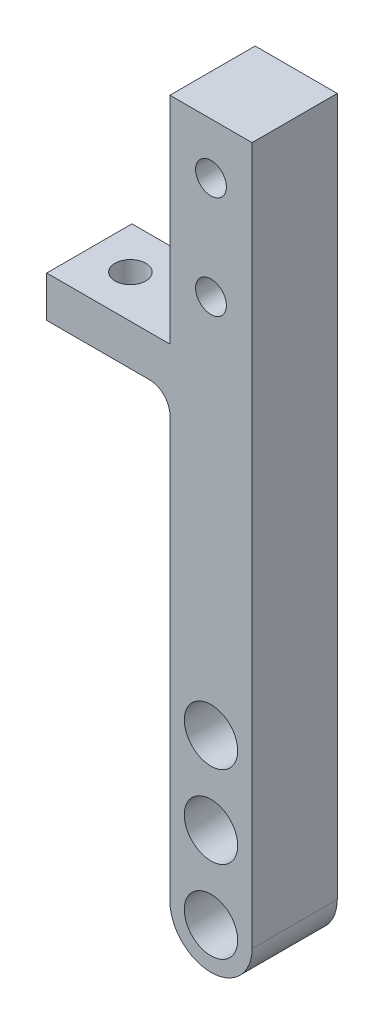
ISO-10303-21;
HEADER;
FILE_DESCRIPTION(('STEP AP214'),'2;1');
FILE_NAME('part.step','',(''),(''),'','','');
FILE_SCHEMA(('AUTOMOTIVE_DESIGN { 1 0 10303 214 1 1 1 1 }'));
ENDSEC;
DATA;
#1=APPLICATION_CONTEXT('core data for automotive mechanical design processes');
#2=APPLICATION_PROTOCOL_DEFINITION('international standard','automotive_design',2000,#1);
#3=PRODUCT_CONTEXT('',#1,'mechanical');
#4=PRODUCT('Part','Part','',(#3));
#5=PRODUCT_RELATED_PRODUCT_CATEGORY('part','',(#4));
#6=PRODUCT_DEFINITION_FORMATION('','',#4);
#7=PRODUCT_DEFINITION_CONTEXT('part definition',#1,'design');
#8=PRODUCT_DEFINITION('design','',#6,#7);
#9=PRODUCT_DEFINITION_SHAPE('','',#8);
#10=(LENGTH_UNIT() NAMED_UNIT(*) SI_UNIT(.MILLI.,.METRE.));
#11=(NAMED_UNIT(*) PLANE_ANGLE_UNIT() SI_UNIT($,.RADIAN.));
#12=(NAMED_UNIT(*) SI_UNIT($,.STERADIAN.) SOLID_ANGLE_UNIT());
#13=UNCERTAINTY_MEASURE_WITH_UNIT(LENGTH_MEASURE(1.E-05),#10,'distance_accuracy_value','');
#14=(GEOMETRIC_REPRESENTATION_CONTEXT(3) GLOBAL_UNCERTAINTY_ASSIGNED_CONTEXT((#13)) GLOBAL_UNIT_ASSIGNED_CONTEXT((#10,
#11,#12)) REPRESENTATION_CONTEXT('',''));
#15=CARTESIAN_POINT('',(0.,0.,0.));
#16=DIRECTION('',(0.,0.,1.));
#17=DIRECTION('',(1.,0.,0.));
#18=AXIS2_PLACEMENT_3D('',#15,#16,#17);
#19=CARTESIAN_POINT('',(-22.4906075029149,0.,4.15));
#20=DIRECTION('',(1.,0.,0.));
#21=DIRECTION('',(0.,0.,-1.));
#22=AXIS2_PLACEMENT_3D('',#19,#20,#21);
#23=PLANE('',#22);
#24=DIRECTION('',(0.,-1.,0.));
#25=VECTOR('',#24,1.);
#26=CARTESIAN_POINT('',(-22.4906075029149,0.,-4.15));
#27=LINE('',#26,#25);
#28=CARTESIAN_POINT('',(-22.4906075029149,-972.480000000007,-4.15));
#29=VERTEX_POINT('',#28);
#30=CARTESIAN_POINT('',(-22.4906075029149,-993.480000000007,-4.15));
#31=VERTEX_POINT('',#30);
#32=EDGE_CURVE('E144',#29,#31,#27,.T.);
#33=ORIENTED_EDGE('',*,*,#32,.T.);
#34=DIRECTION('',(0.,0.,-1.));
#35=VECTOR('',#34,1.);
#36=CARTESIAN_POINT('',(-22.4906075029149,-993.480000000007,4.15));
#37=LINE('',#36,#35);
#38=CARTESIAN_POINT('',(-22.4906075029149,-993.480000000007,4.15));
#39=VERTEX_POINT('',#38);
#40=EDGE_CURVE('E121',#39,#31,#37,.T.);
#41=ORIENTED_EDGE('',*,*,#40,.F.);
#42=DIRECTION('',(0.,-1.,0.));
#43=VECTOR('',#42,1.);
#44=CARTESIAN_POINT('',(-22.4906075029149,0.,4.15));
#45=LINE('',#44,#43);
#46=CARTESIAN_POINT('',(-22.4906075029149,-972.480000000007,4.15));
#47=VERTEX_POINT('',#46);
#48=EDGE_CURVE('E130',#47,#39,#45,.T.);
#49=ORIENTED_EDGE('',*,*,#48,.F.);
#50=DIRECTION('',(0.,0.,-1.));
#51=VECTOR('',#50,1.);
#52=CARTESIAN_POINT('',(-22.4906075029149,-972.480000000007,4.15));
#53=LINE('',#52,#51);
#54=EDGE_CURVE('E209',#47,#29,#53,.T.);
#55=ORIENTED_EDGE('',*,*,#54,.T.);
#56=EDGE_LOOP('',(#33,#41,#49,#55));
#57=FACE_BOUND('',#56,.T.);
#58=ADVANCED_FACE('F47',(#57),#23,.F.);
#59=CARTESIAN_POINT('',(0.,-993.480000000007,4.15));
#60=DIRECTION('',(0.,-1.,0.));
#61=DIRECTION('',(0.,0.,-1.));
#62=AXIS2_PLACEMENT_3D('',#59,#60,#61);
#63=PLANE('',#62);
#64=CARTESIAN_POINT('',(-30.4906075029149,-993.480000000007,0.));
#65=DIRECTION('',(0.,1.,0.));
#66=DIRECTION('',(0.,0.,1.));
#67=AXIS2_PLACEMENT_3D('',#64,#65,#66);
#68=CIRCLE('',#67,1.50000000001362);
#69=CARTESIAN_POINT('',(-30.4906075029149,-993.480000000007,1.50000000001362));
#70=VERTEX_POINT('',#69);
#71=EDGE_CURVE('E160',#70,#70,#68,.T.);
#72=ORIENTED_EDGE('',*,*,#71,.F.);
#73=EDGE_LOOP('',(#72));
#74=FACE_BOUND('',#73,.T.);
#75=DIRECTION('',(-1.,0.,0.));
#76=VECTOR('',#75,1.);
#77=CARTESIAN_POINT('',(0.,-993.480000000007,-4.15));
#78=LINE('',#77,#76);
#79=CARTESIAN_POINT('',(-34.4906075029149,-993.480000000007,-4.15));
#80=VERTEX_POINT('',#79);
#81=EDGE_CURVE('E228',#31,#80,#78,.T.);
#82=ORIENTED_EDGE('',*,*,#81,.T.);
#83=DIRECTION('',(0.,0.,-1.));
#84=VECTOR('',#83,1.);
#85=CARTESIAN_POINT('',(-34.4906075029149,-993.480000000007,4.15));
#86=LINE('',#85,#84);
#87=CARTESIAN_POINT('',(-34.4906075029149,-993.480000000007,4.15));
#88=VERTEX_POINT('',#87);
#89=EDGE_CURVE('E124',#88,#80,#86,.T.);
#90=ORIENTED_EDGE('',*,*,#89,.F.);
#91=DIRECTION('',(-1.,0.,0.));
#92=VECTOR('',#91,1.);
#93=CARTESIAN_POINT('',(0.,-993.480000000007,4.15));
#94=LINE('',#93,#92);
#95=EDGE_CURVE('E117',#39,#88,#94,.T.);
#96=ORIENTED_EDGE('',*,*,#95,.F.);
#97=ORIENTED_EDGE('',*,*,#40,.T.);
#98=EDGE_LOOP('',(#82,#90,#96,#97));
#99=FACE_BOUND('',#98,.T.);
#100=ADVANCED_FACE('F119',(#74,#99),#63,.F.);
#101=CARTESIAN_POINT('',(-34.4906075029149,0.,4.15));
#102=DIRECTION('',(1.,0.,0.));
#103=DIRECTION('',(0.,0.,-1.));
#104=AXIS2_PLACEMENT_3D('',#101,#102,#103);
#105=PLANE('',#104);
#106=DIRECTION('',(0.,-1.,0.));
#107=VECTOR('',#106,1.);
#108=CARTESIAN_POINT('',(-34.4906075029149,0.,-4.15));
#109=LINE('',#108,#107);
#110=CARTESIAN_POINT('',(-34.4906075029149,-997.480000000007,-4.15));
#111=VERTEX_POINT('',#110);
#112=EDGE_CURVE('E232',#80,#111,#109,.T.);
#113=ORIENTED_EDGE('',*,*,#112,.T.);
#114=DIRECTION('',(0.,0.,-1.));
#115=VECTOR('',#114,1.);
#116=CARTESIAN_POINT('',(-34.4906075029149,-997.480000000007,4.15));
#117=LINE('',#116,#115);
#118=CARTESIAN_POINT('',(-34.4906075029149,-997.480000000007,4.15));
#119=VERTEX_POINT('',#118);
#120=EDGE_CURVE('E152',#119,#111,#117,.T.);
#121=ORIENTED_EDGE('',*,*,#120,.F.);
#122=DIRECTION('',(0.,-1.,0.));
#123=VECTOR('',#122,1.);
#124=CARTESIAN_POINT('',(-34.4906075029149,0.,4.15));
#125=LINE('',#124,#123);
#126=EDGE_CURVE('E129',#88,#119,#125,.T.);
#127=ORIENTED_EDGE('',*,*,#126,.F.);
#128=ORIENTED_EDGE('',*,*,#89,.T.);
#129=EDGE_LOOP('',(#113,#121,#127,#128));
#130=FACE_BOUND('',#129,.T.);
#131=ADVANCED_FACE('F267',(#130),#105,.F.);
#132=CARTESIAN_POINT('',(0.,-997.480000000007,4.15));
#133=DIRECTION('',(0.,-1.,0.));
#134=DIRECTION('',(0.,0.,-1.));
#135=AXIS2_PLACEMENT_3D('',#132,#133,#134);
#136=PLANE('',#135);
#137=CARTESIAN_POINT('',(-30.4906075029149,-997.480000000007,0.));
#138=DIRECTION('',(0.,-1.,0.));
#139=DIRECTION('',(0.,0.,-1.));
#140=AXIS2_PLACEMENT_3D('',#137,#138,#139);
#141=CIRCLE('',#140,1.50000000001362);
#142=CARTESIAN_POINT('',(-30.4906075029149,-997.480000000007,-1.50000000001362));
#143=VERTEX_POINT('',#142);
#144=EDGE_CURVE('E156',#143,#143,#141,.T.);
#145=ORIENTED_EDGE('',*,*,#144,.F.);
#146=EDGE_LOOP('',(#145));
#147=FACE_BOUND('',#146,.T.);
#148=DIRECTION('',(-1.,0.,0.));
#149=VECTOR('',#148,1.);
#150=CARTESIAN_POINT('',(0.,-997.480000000007,-4.15));
#151=LINE('',#150,#149);
#152=CARTESIAN_POINT('',(-24.4906075029149,-997.480000000007,-4.15));
#153=VERTEX_POINT('',#152);
#154=EDGE_CURVE('E236',#153,#111,#151,.T.);
#155=ORIENTED_EDGE('',*,*,#154,.F.);
#156=DIRECTION('',(0.,0.,-1.));
#157=VECTOR('',#156,1.);
#158=CARTESIAN_POINT('',(-24.4906075029149,-997.480000000007,4.15));
#159=LINE('',#158,#157);
#160=CARTESIAN_POINT('',(-24.4906075029149,-997.480000000007,4.15));
#161=VERTEX_POINT('',#160);
#162=EDGE_CURVE('E63',#153,#161,#159,.F.);
#163=ORIENTED_EDGE('',*,*,#162,.T.);
#164=DIRECTION('',(-1.,0.,0.));
#165=VECTOR('',#164,1.);
#166=CARTESIAN_POINT('',(0.,-997.480000000007,4.15));
#167=LINE('',#166,#165);
#168=EDGE_CURVE('E198',#161,#119,#167,.T.);
#169=ORIENTED_EDGE('',*,*,#168,.T.);
#170=ORIENTED_EDGE('',*,*,#120,.T.);
#171=EDGE_LOOP('',(#155,#163,#169,#170));
#172=FACE_BOUND('',#171,.T.);
#173=ADVANCED_FACE('F264',(#147,#172),#136,.T.);
#174=CARTESIAN_POINT('',(-22.4906075029149,-999.480000000007,4.15));
#175=VERTEX_POINT('',#174);
#176=CARTESIAN_POINT('',(-22.4906075029149,-1040.48000000001,4.15));
#177=VERTEX_POINT('',#176);
#178=EDGE_CURVE('E142',#175,#177,#45,.T.);
#179=ORIENTED_EDGE('',*,*,#178,.F.);
#180=DIRECTION('',(0.,0.,-1.));
#181=VECTOR('',#180,1.);
#182=CARTESIAN_POINT('',(-22.4906075029149,-999.480000000007,4.15));
#183=LINE('',#182,#181);
#184=CARTESIAN_POINT('',(-22.4906075029149,-999.480000000007,-4.15));
#185=VERTEX_POINT('',#184);
#186=EDGE_CURVE('E146',#175,#185,#183,.T.);
#187=ORIENTED_EDGE('',*,*,#186,.T.);
#188=CARTESIAN_POINT('',(-22.4906075029149,-1040.48000000001,-4.15));
#189=VERTEX_POINT('',#188);
#190=EDGE_CURVE('E229',#185,#189,#27,.T.);
#191=ORIENTED_EDGE('',*,*,#190,.T.);
#192=DIRECTION('',(0.,0.,-1.));
#193=VECTOR('',#192,1.);
#194=CARTESIAN_POINT('',(-22.4906075029149,-1040.48000000001,4.15));
#195=LINE('',#194,#193);
#196=EDGE_CURVE('E258',#177,#189,#195,.T.);
#197=ORIENTED_EDGE('',*,*,#196,.F.);
#198=EDGE_LOOP('',(#179,#187,#191,#197));
#199=FACE_BOUND('',#198,.T.);
#200=ADVANCED_FACE('F283',(#199),#23,.F.);
#201=CARTESIAN_POINT('',(-18.4906075027922,-1040.48000000001,4.15));
#202=DIRECTION('',(0.,0.,-1.));
#203=DIRECTION('',(-1.,0.,0.));
#204=AXIS2_PLACEMENT_3D('',#201,#202,#203);
#205=CYLINDRICAL_SURFACE('',#204,4.00000000000082);
#206=CARTESIAN_POINT('',(-18.4906075027922,-1040.48000000001,-4.15));
#207=DIRECTION('',(0.,0.,1.));
#208=DIRECTION('',(1.,0.,0.));
#209=AXIS2_PLACEMENT_3D('',#206,#207,#208);
#210=CIRCLE('',#209,4.00000000000082);
#211=CARTESIAN_POINT('',(-14.4906075029133,-1040.48000000001,-4.15));
#212=VERTEX_POINT('',#211);
#213=EDGE_CURVE('E239',#189,#212,#210,.T.);
#214=ORIENTED_EDGE('',*,*,#213,.T.);
#215=DIRECTION('',(0.,0.,-1.));
#216=VECTOR('',#215,1.);
#217=CARTESIAN_POINT('',(-14.4906075029133,-1040.48000000001,4.15));
#218=LINE('',#217,#216);
#219=CARTESIAN_POINT('',(-14.4906075029133,-1040.48000000001,4.15));
#220=VERTEX_POINT('',#219);
#221=EDGE_CURVE('E255',#220,#212,#218,.T.);
#222=ORIENTED_EDGE('',*,*,#221,.F.);
#223=CARTESIAN_POINT('',(-18.4906075027922,-1040.48000000001,4.15));
#224=DIRECTION('',(0.,0.,1.));
#225=DIRECTION('',(1.,0.,0.));
#226=AXIS2_PLACEMENT_3D('',#223,#224,#225);
#227=CIRCLE('',#226,4.00000000000082);
#228=EDGE_CURVE('E201',#177,#220,#227,.T.);
#229=ORIENTED_EDGE('',*,*,#228,.F.);
#230=ORIENTED_EDGE('',*,*,#196,.T.);
#231=EDGE_LOOP('',(#214,#222,#229,#230));
#232=FACE_BOUND('',#231,.T.);
#233=ADVANCED_FACE('F278',(#232),#205,.T.);
#234=CARTESIAN_POINT('',(-14.4906075029133,0.,4.15));
#235=DIRECTION('',(1.,0.,0.));
#236=DIRECTION('',(0.,0.,-1.));
#237=AXIS2_PLACEMENT_3D('',#234,#235,#236);
#238=PLANE('',#237);
#239=DIRECTION('',(0.,-1.,0.));
#240=VECTOR('',#239,1.);
#241=CARTESIAN_POINT('',(-14.4906075029133,0.,-4.15));
#242=LINE('',#241,#240);
#243=CARTESIAN_POINT('',(-14.4906075029133,-972.480000000007,-4.15));
#244=VERTEX_POINT('',#243);
#245=EDGE_CURVE('E243',#244,#212,#242,.T.);
#246=ORIENTED_EDGE('',*,*,#245,.F.);
#247=DIRECTION('',(0.,0.,-1.));
#248=VECTOR('',#247,1.);
#249=CARTESIAN_POINT('',(-14.4906075029133,-972.480000000007,4.15));
#250=LINE('',#249,#248);
#251=CARTESIAN_POINT('',(-14.4906075029133,-972.480000000007,4.15));
#252=VERTEX_POINT('',#251);
#253=EDGE_CURVE('E252',#252,#244,#250,.T.);
#254=ORIENTED_EDGE('',*,*,#253,.F.);
#255=DIRECTION('',(0.,-1.,0.));
#256=VECTOR('',#255,1.);
#257=CARTESIAN_POINT('',(-14.4906075029133,0.,4.15));
#258=LINE('',#257,#256);
#259=EDGE_CURVE('E204',#252,#220,#258,.T.);
#260=ORIENTED_EDGE('',*,*,#259,.T.);
#261=ORIENTED_EDGE('',*,*,#221,.T.);
#262=EDGE_LOOP('',(#246,#254,#260,#261));
#263=FACE_BOUND('',#262,.T.);
#264=ADVANCED_FACE('F274',(#263),#238,.T.);
#265=CARTESIAN_POINT('',(-18.4906075027921,-1024.48000000001,4.15));
#266=DIRECTION('',(0.,0.,-1.));
#267=DIRECTION('',(-1.,0.,0.));
#268=AXIS2_PLACEMENT_3D('',#265,#266,#267);
#269=CYLINDRICAL_SURFACE('',#268,2.60000000000001);
#270=CARTESIAN_POINT('',(-18.4906075027921,-1024.48000000001,4.15));
#271=DIRECTION('',(0.,0.,1.));
#272=DIRECTION('',(1.,0.,0.));
#273=AXIS2_PLACEMENT_3D('',#270,#271,#272);
#274=CIRCLE('',#273,2.60000000000001);
#275=CARTESIAN_POINT('',(-21.0906075027921,-1024.48000000001,4.15));
#276=VERTEX_POINT('',#275);
#277=EDGE_CURVE('E140',#276,#276,#274,.T.);
#278=CARTESIAN_POINT('',(-18.4906075027921,-1024.48000000001,-4.15));
#279=DIRECTION('',(0.,0.,1.));
#280=DIRECTION('',(1.,0.,0.));
#281=AXIS2_PLACEMENT_3D('',#278,#279,#280);
#282=CIRCLE('',#281,2.60000000000001);
#283=CARTESIAN_POINT('',(-21.0906075027921,-1024.48000000001,-4.15));
#284=VERTEX_POINT('',#283);
#285=EDGE_CURVE('E222',#284,#284,#282,.T.);
#286=CARTESIAN_POINT('',(-21.0906075027921,-1024.48000000001,4.15));
#287=CARTESIAN_POINT('',(-21.0906075027921,-1024.48000000001,4.06354166666667));
#288=CARTESIAN_POINT('',(-21.0906075027921,-1024.48000000001,3.97708333333333));
#289=CARTESIAN_POINT('',(-21.0906075027921,-1024.48000000001,3.80416666666667));
#290=CARTESIAN_POINT('',(-21.0906075027921,-1024.48000000001,3.71770833333333));
#291=CARTESIAN_POINT('',(-21.0906075027921,-1024.48000000001,3.54479166666667));
#292=CARTESIAN_POINT('',(-21.0906075027921,-1024.48000000001,3.45833333333333));
#293=CARTESIAN_POINT('',(-21.0906075027921,-1024.48000000001,3.28541666666667));
#294=CARTESIAN_POINT('',(-21.0906075027921,-1024.48000000001,3.19895833333333));
#295=CARTESIAN_POINT('',(-21.0906075027921,-1024.48000000001,3.02604166666667));
#296=CARTESIAN_POINT('',(-21.0906075027921,-1024.48000000001,2.93958333333333));
#297=CARTESIAN_POINT('',(-21.0906075027921,-1024.48000000001,2.76666666666667));
#298=CARTESIAN_POINT('',(-21.0906075027921,-1024.48000000001,2.68020833333333));
#299=CARTESIAN_POINT('',(-21.0906075027921,-1024.48000000001,2.50729166666667));
#300=CARTESIAN_POINT('',(-21.0906075027921,-1024.48000000001,2.42083333333333));
#301=CARTESIAN_POINT('',(-21.0906075027921,-1024.48000000001,2.24791666666667));
#302=CARTESIAN_POINT('',(-21.0906075027921,-1024.48000000001,2.16145833333333));
#303=CARTESIAN_POINT('',(-21.0906075027921,-1024.48000000001,1.98854166666667));
#304=CARTESIAN_POINT('',(-21.0906075027921,-1024.48000000001,1.90208333333333));
#305=CARTESIAN_POINT('',(-21.0906075027921,-1024.48000000001,1.72916666666667));
#306=CARTESIAN_POINT('',(-21.0906075027921,-1024.48000000001,1.64270833333333));
#307=CARTESIAN_POINT('',(-21.0906075027921,-1024.48000000001,1.46979166666667));
#308=CARTESIAN_POINT('',(-21.0906075027921,-1024.48000000001,1.38333333333333));
#309=CARTESIAN_POINT('',(-21.0906075027921,-1024.48000000001,1.21041666666667));
#310=CARTESIAN_POINT('',(-21.0906075027921,-1024.48000000001,1.12395833333333));
#311=CARTESIAN_POINT('',(-21.0906075027921,-1024.48000000001,0.951041666666666));
#312=CARTESIAN_POINT('',(-21.0906075027921,-1024.48000000001,0.864583333333333));
#313=CARTESIAN_POINT('',(-21.0906075027921,-1024.48000000001,0.691666666666666));
#314=CARTESIAN_POINT('',(-21.0906075027921,-1024.48000000001,0.605208333333333));
#315=CARTESIAN_POINT('',(-21.0906075027921,-1024.48000000001,0.432291666666666));
#316=CARTESIAN_POINT('',(-21.0906075027921,-1024.48000000001,0.345833333333333));
#317=CARTESIAN_POINT('',(-21.0906075027921,-1024.48000000001,0.172916666666666));
#318=CARTESIAN_POINT('',(-21.0906075027921,-1024.48000000001,0.0864583333333331));
#319=CARTESIAN_POINT('',(-21.0906075027921,-1024.48000000001,-0.0864583333333333));
#320=CARTESIAN_POINT('',(-21.0906075027921,-1024.48000000001,-0.172916666666667));
#321=CARTESIAN_POINT('',(-21.0906075027921,-1024.48000000001,-0.345833333333333));
#322=CARTESIAN_POINT('',(-21.0906075027921,-1024.48000000001,-0.432291666666667));
#323=CARTESIAN_POINT('',(-21.0906075027921,-1024.48000000001,-0.605208333333333));
#324=CARTESIAN_POINT('',(-21.0906075027921,-1024.48000000001,-0.691666666666667));
#325=CARTESIAN_POINT('',(-21.0906075027921,-1024.48000000001,-0.864583333333333));
#326=CARTESIAN_POINT('',(-21.0906075027921,-1024.48000000001,-0.951041666666667));
#327=CARTESIAN_POINT('',(-21.0906075027921,-1024.48000000001,-1.12395833333333));
#328=CARTESIAN_POINT('',(-21.0906075027921,-1024.48000000001,-1.21041666666667));
#329=CARTESIAN_POINT('',(-21.0906075027921,-1024.48000000001,-1.38333333333333));
#330=CARTESIAN_POINT('',(-21.0906075027921,-1024.48000000001,-1.46979166666667));
#331=CARTESIAN_POINT('',(-21.0906075027921,-1024.48000000001,-1.64270833333333));
#332=CARTESIAN_POINT('',(-21.0906075027921,-1024.48000000001,-1.72916666666667));
#333=CARTESIAN_POINT('',(-21.0906075027921,-1024.48000000001,-1.90208333333333));
#334=CARTESIAN_POINT('',(-21.0906075027921,-1024.48000000001,-1.98854166666667));
#335=CARTESIAN_POINT('',(-21.0906075027921,-1024.48000000001,-2.16145833333333));
#336=CARTESIAN_POINT('',(-21.0906075027921,-1024.48000000001,-2.24791666666667));
#337=CARTESIAN_POINT('',(-21.0906075027921,-1024.48000000001,-2.42083333333333));
#338=CARTESIAN_POINT('',(-21.0906075027921,-1024.48000000001,-2.50729166666667));
#339=CARTESIAN_POINT('',(-21.0906075027921,-1024.48000000001,-2.68020833333333));
#340=CARTESIAN_POINT('',(-21.0906075027921,-1024.48000000001,-2.76666666666667));
#341=CARTESIAN_POINT('',(-21.0906075027921,-1024.48000000001,-2.93958333333333));
#342=CARTESIAN_POINT('',(-21.0906075027921,-1024.48000000001,-3.02604166666667));
#343=CARTESIAN_POINT('',(-21.0906075027921,-1024.48000000001,-3.19895833333333));
#344=CARTESIAN_POINT('',(-21.0906075027921,-1024.48000000001,-3.28541666666667));
#345=CARTESIAN_POINT('',(-21.0906075027921,-1024.48000000001,-3.45833333333333));
#346=CARTESIAN_POINT('',(-21.0906075027921,-1024.48000000001,-3.54479166666667));
#347=CARTESIAN_POINT('',(-21.0906075027921,-1024.48000000001,-3.71770833333333));
#348=CARTESIAN_POINT('',(-21.0906075027921,-1024.48000000001,-3.80416666666667));
#349=CARTESIAN_POINT('',(-21.0906075027921,-1024.48000000001,-3.97708333333333));
#350=CARTESIAN_POINT('',(-21.0906075027921,-1024.48000000001,-4.06354166666667));
#351=CARTESIAN_POINT('',(-21.0906075027921,-1024.48000000001,-4.15));
#352=B_SPLINE_CURVE_WITH_KNOTS('',3,(#286,#287,#288,#289,#290,#291,#292,#293,#294,#295,#296,
#297,#298,#299,#300,#301,#302,#303,#304,#305,#306,#307,#308,#309,#310,#311,#312,#313,#314,#315,
#316,#317,#318,#319,#320,#321,#322,#323,#324,#325,#326,#327,#328,#329,#330,#331,#332,#333,#334,
#335,#336,#337,#338,#339,#340,#341,#342,#343,#344,#345,#346,#347,#348,#349,#350,#351),
.UNSPECIFIED.,.F.,.F.,(4,2,2,2,2,2,2,2,2,2,2,2,2,2,2,2,2,2,2,2,2,2,2,2,2,2,2,2,2,2,2,2,4),(0.,
0.259375,0.518750000000001,0.778125000000001,1.0375,1.296875,1.55625,1.815625,2.075,2.334375,
2.59375,2.853125,3.1125,3.371875,3.63125,3.890625,4.15,4.409375,4.66875,4.928125,5.1875,
5.446875,5.70625,5.965625,6.225,6.484375,6.74375,7.003125,7.2625,7.521875,7.78125,8.040625,8.3),.UNSPECIFIED.);
#353=EDGE_CURVE('BSEAM317',#276,#284,#352,.T.);
#354=ORIENTED_EDGE('',*,*,#277,.T.);
#355=ORIENTED_EDGE('',*,*,#285,.F.);
#356=ORIENTED_EDGE('',*,*,#353,.T.);
#357=ORIENTED_EDGE('',*,*,#353,.F.);
#358=EDGE_LOOP('',(#354,#356,#355,#357));
#359=FACE_BOUND('',#358,.T.);
#360=ADVANCED_FACE('F317',(#359),#269,.F.);
#361=CARTESIAN_POINT('',(-18.4906075028776,-977.480000000007,4.15));
#362=DIRECTION('',(0.,0.,-1.));
#363=DIRECTION('',(-1.,0.,0.));
#364=AXIS2_PLACEMENT_3D('',#361,#362,#363);
#365=CYLINDRICAL_SURFACE('',#364,1.50000000001362);
#366=CARTESIAN_POINT('',(-18.4906075028776,-977.480000000007,4.15));
#367=DIRECTION('',(0.,0.,1.));
#368=DIRECTION('',(1.,0.,0.));
#369=AXIS2_PLACEMENT_3D('',#366,#367,#368);
#370=CIRCLE('',#369,1.50000000001362);
#371=CARTESIAN_POINT('',(-19.9906075028912,-977.480000000007,4.15));
#372=VERTEX_POINT('',#371);
#373=EDGE_CURVE('E189',#372,#372,#370,.T.);
#374=CARTESIAN_POINT('',(-18.4906075028776,-977.480000000007,-4.15));
#375=DIRECTION('',(0.,0.,1.));
#376=DIRECTION('',(1.,0.,0.));
#377=AXIS2_PLACEMENT_3D('',#374,#375,#376);
#378=CIRCLE('',#377,1.50000000001362);
#379=CARTESIAN_POINT('',(-19.9906075028912,-977.480000000007,-4.15));
#380=VERTEX_POINT('',#379);
#381=EDGE_CURVE('E218',#380,#380,#378,.T.);
#382=CARTESIAN_POINT('',(-19.9906075028912,-977.480000000007,4.15));
#383=CARTESIAN_POINT('',(-19.9906075028912,-977.480000000007,4.06354166666667));
#384=CARTESIAN_POINT('',(-19.9906075028912,-977.480000000007,3.97708333333333));
#385=CARTESIAN_POINT('',(-19.9906075028912,-977.480000000007,3.80416666666667));
#386=CARTESIAN_POINT('',(-19.9906075028912,-977.480000000007,3.71770833333333));
#387=CARTESIAN_POINT('',(-19.9906075028912,-977.480000000007,3.54479166666667));
#388=CARTESIAN_POINT('',(-19.9906075028912,-977.480000000007,3.45833333333333));
#389=CARTESIAN_POINT('',(-19.9906075028912,-977.480000000007,3.28541666666667));
#390=CARTESIAN_POINT('',(-19.9906075028912,-977.480000000007,3.19895833333333));
#391=CARTESIAN_POINT('',(-19.9906075028912,-977.480000000007,3.02604166666667));
#392=CARTESIAN_POINT('',(-19.9906075028912,-977.480000000007,2.93958333333333));
#393=CARTESIAN_POINT('',(-19.9906075028912,-977.480000000007,2.76666666666667));
#394=CARTESIAN_POINT('',(-19.9906075028912,-977.480000000007,2.68020833333333));
#395=CARTESIAN_POINT('',(-19.9906075028912,-977.480000000007,2.50729166666667));
#396=CARTESIAN_POINT('',(-19.9906075028912,-977.480000000007,2.42083333333333));
#397=CARTESIAN_POINT('',(-19.9906075028912,-977.480000000007,2.24791666666667));
#398=CARTESIAN_POINT('',(-19.9906075028912,-977.480000000007,2.16145833333333));
#399=CARTESIAN_POINT('',(-19.9906075028912,-977.480000000007,1.98854166666667));
#400=CARTESIAN_POINT('',(-19.9906075028912,-977.480000000007,1.90208333333333));
#401=CARTESIAN_POINT('',(-19.9906075028912,-977.480000000007,1.72916666666667));
#402=CARTESIAN_POINT('',(-19.9906075028912,-977.480000000007,1.64270833333333));
#403=CARTESIAN_POINT('',(-19.9906075028912,-977.480000000007,1.46979166666667));
#404=CARTESIAN_POINT('',(-19.9906075028912,-977.480000000007,1.38333333333333));
#405=CARTESIAN_POINT('',(-19.9906075028912,-977.480000000007,1.21041666666667));
#406=CARTESIAN_POINT('',(-19.9906075028912,-977.480000000007,1.12395833333333));
#407=CARTESIAN_POINT('',(-19.9906075028912,-977.480000000007,0.951041666666666));
#408=CARTESIAN_POINT('',(-19.9906075028912,-977.480000000007,0.864583333333333));
#409=CARTESIAN_POINT('',(-19.9906075028912,-977.480000000007,0.691666666666666));
#410=CARTESIAN_POINT('',(-19.9906075028912,-977.480000000007,0.605208333333333));
#411=CARTESIAN_POINT('',(-19.9906075028912,-977.480000000007,0.432291666666666));
#412=CARTESIAN_POINT('',(-19.9906075028912,-977.480000000007,0.345833333333333));
#413=CARTESIAN_POINT('',(-19.9906075028912,-977.480000000007,0.172916666666666));
#414=CARTESIAN_POINT('',(-19.9906075028912,-977.480000000007,0.0864583333333331));
#415=CARTESIAN_POINT('',(-19.9906075028912,-977.480000000007,-0.0864583333333333));
#416=CARTESIAN_POINT('',(-19.9906075028912,-977.480000000007,-0.172916666666667));
#417=CARTESIAN_POINT('',(-19.9906075028912,-977.480000000007,-0.345833333333333));
#418=CARTESIAN_POINT('',(-19.9906075028912,-977.480000000007,-0.432291666666667));
#419=CARTESIAN_POINT('',(-19.9906075028912,-977.480000000007,-0.605208333333333));
#420=CARTESIAN_POINT('',(-19.9906075028912,-977.480000000007,-0.691666666666667));
#421=CARTESIAN_POINT('',(-19.9906075028912,-977.480000000007,-0.864583333333333));
#422=CARTESIAN_POINT('',(-19.9906075028912,-977.480000000007,-0.951041666666667));
#423=CARTESIAN_POINT('',(-19.9906075028912,-977.480000000007,-1.12395833333333));
#424=CARTESIAN_POINT('',(-19.9906075028912,-977.480000000007,-1.21041666666667));
#425=CARTESIAN_POINT('',(-19.9906075028912,-977.480000000007,-1.38333333333333));
#426=CARTESIAN_POINT('',(-19.9906075028912,-977.480000000007,-1.46979166666667));
#427=CARTESIAN_POINT('',(-19.9906075028912,-977.480000000007,-1.64270833333333));
#428=CARTESIAN_POINT('',(-19.9906075028912,-977.480000000007,-1.72916666666667));
#429=CARTESIAN_POINT('',(-19.9906075028912,-977.480000000007,-1.90208333333333));
#430=CARTESIAN_POINT('',(-19.9906075028912,-977.480000000007,-1.98854166666667));
#431=CARTESIAN_POINT('',(-19.9906075028912,-977.480000000007,-2.16145833333333));
#432=CARTESIAN_POINT('',(-19.9906075028912,-977.480000000007,-2.24791666666667));
#433=CARTESIAN_POINT('',(-19.9906075028912,-977.480000000007,-2.42083333333333));
#434=CARTESIAN_POINT('',(-19.9906075028912,-977.480000000007,-2.50729166666667));
#435=CARTESIAN_POINT('',(-19.9906075028912,-977.480000000007,-2.68020833333333));
#436=CARTESIAN_POINT('',(-19.9906075028912,-977.480000000007,-2.76666666666667));
#437=CARTESIAN_POINT('',(-19.9906075028912,-977.480000000007,-2.93958333333333));
#438=CARTESIAN_POINT('',(-19.9906075028912,-977.480000000007,-3.02604166666667));
#439=CARTESIAN_POINT('',(-19.9906075028912,-977.480000000007,-3.19895833333333));
#440=CARTESIAN_POINT('',(-19.9906075028912,-977.480000000007,-3.28541666666667));
#441=CARTESIAN_POINT('',(-19.9906075028912,-977.480000000007,-3.45833333333333));
#442=CARTESIAN_POINT('',(-19.9906075028912,-977.480000000007,-3.54479166666667));
#443=CARTESIAN_POINT('',(-19.9906075028912,-977.480000000007,-3.71770833333333));
#444=CARTESIAN_POINT('',(-19.9906075028912,-977.480000000007,-3.80416666666667));
#445=CARTESIAN_POINT('',(-19.9906075028912,-977.480000000007,-3.97708333333333));
#446=CARTESIAN_POINT('',(-19.9906075028912,-977.480000000007,-4.06354166666667));
#447=CARTESIAN_POINT('',(-19.9906075028912,-977.480000000007,-4.15));
#448=B_SPLINE_CURVE_WITH_KNOTS('',3,(#382,#383,#384,#385,#386,#387,#388,#389,#390,#391,#392,
#393,#394,#395,#396,#397,#398,#399,#400,#401,#402,#403,#404,#405,#406,#407,#408,#409,#410,#411,
#412,#413,#414,#415,#416,#417,#418,#419,#420,#421,#422,#423,#424,#425,#426,#427,#428,#429,#430,
#431,#432,#433,#434,#435,#436,#437,#438,#439,#440,#441,#442,#443,#444,#445,#446,#447),
.UNSPECIFIED.,.F.,.F.,(4,2,2,2,2,2,2,2,2,2,2,2,2,2,2,2,2,2,2,2,2,2,2,2,2,2,2,2,2,2,2,2,4),(0.,
0.259375,0.518750000000001,0.778125000000001,1.0375,1.296875,1.55625,1.815625,2.075,2.334375,
2.59375,2.853125,3.1125,3.371875,3.63125,3.890625,4.15,4.409375,4.66875,4.928125,5.1875,
5.446875,5.70625,5.965625,6.225,6.484375,6.74375,7.003125,7.2625,7.521875,7.78125,8.040625,8.3),.UNSPECIFIED.);
#449=EDGE_CURVE('BSEAM320',#372,#380,#448,.T.);
#450=ORIENTED_EDGE('',*,*,#373,.T.);
#451=ORIENTED_EDGE('',*,*,#381,.F.);
#452=ORIENTED_EDGE('',*,*,#449,.T.);
#453=ORIENTED_EDGE('',*,*,#449,.F.);
#454=EDGE_LOOP('',(#450,#452,#451,#453));
#455=FACE_BOUND('',#454,.T.);
#456=ADVANCED_FACE('F320',(#455),#365,.F.);
#457=CARTESIAN_POINT('',(-18.4906075028776,-987.480000000007,4.15));
#458=DIRECTION('',(0.,0.,-1.));
#459=DIRECTION('',(-1.,0.,0.));
#460=AXIS2_PLACEMENT_3D('',#457,#458,#459);
#461=CYLINDRICAL_SURFACE('',#460,1.50000000001362);
#462=CARTESIAN_POINT('',(-18.4906075028776,-987.480000000007,4.15));
#463=DIRECTION('',(0.,0.,1.));
#464=DIRECTION('',(1.,0.,0.));
#465=AXIS2_PLACEMENT_3D('',#462,#463,#464);
#466=CIRCLE('',#465,1.50000000001362);
#467=CARTESIAN_POINT('',(-19.9906075028912,-987.480000000007,4.15));
#468=VERTEX_POINT('',#467);
#469=EDGE_CURVE('E185',#468,#468,#466,.T.);
#470=CARTESIAN_POINT('',(-18.4906075028776,-987.480000000007,-4.15));
#471=DIRECTION('',(0.,0.,1.));
#472=DIRECTION('',(1.,0.,0.));
#473=AXIS2_PLACEMENT_3D('',#470,#471,#472);
#474=CIRCLE('',#473,1.50000000001362);
#475=CARTESIAN_POINT('',(-19.9906075028912,-987.480000000007,-4.15));
#476=VERTEX_POINT('',#475);
#477=EDGE_CURVE('E214',#476,#476,#474,.T.);
#478=CARTESIAN_POINT('',(-19.9906075028912,-987.480000000007,4.15));
#479=CARTESIAN_POINT('',(-19.9906075028912,-987.480000000007,4.06354166666667));
#480=CARTESIAN_POINT('',(-19.9906075028912,-987.480000000007,3.97708333333333));
#481=CARTESIAN_POINT('',(-19.9906075028912,-987.480000000007,3.80416666666667));
#482=CARTESIAN_POINT('',(-19.9906075028912,-987.480000000007,3.71770833333333));
#483=CARTESIAN_POINT('',(-19.9906075028912,-987.480000000007,3.54479166666667));
#484=CARTESIAN_POINT('',(-19.9906075028912,-987.480000000007,3.45833333333333));
#485=CARTESIAN_POINT('',(-19.9906075028912,-987.480000000007,3.28541666666667));
#486=CARTESIAN_POINT('',(-19.9906075028912,-987.480000000007,3.19895833333333));
#487=CARTESIAN_POINT('',(-19.9906075028912,-987.480000000007,3.02604166666667));
#488=CARTESIAN_POINT('',(-19.9906075028912,-987.480000000007,2.93958333333333));
#489=CARTESIAN_POINT('',(-19.9906075028912,-987.480000000007,2.76666666666667));
#490=CARTESIAN_POINT('',(-19.9906075028912,-987.480000000007,2.68020833333333));
#491=CARTESIAN_POINT('',(-19.9906075028912,-987.480000000007,2.50729166666667));
#492=CARTESIAN_POINT('',(-19.9906075028912,-987.480000000007,2.42083333333333));
#493=CARTESIAN_POINT('',(-19.9906075028912,-987.480000000007,2.24791666666667));
#494=CARTESIAN_POINT('',(-19.9906075028912,-987.480000000007,2.16145833333333));
#495=CARTESIAN_POINT('',(-19.9906075028912,-987.480000000007,1.98854166666667));
#496=CARTESIAN_POINT('',(-19.9906075028912,-987.480000000007,1.90208333333333));
#497=CARTESIAN_POINT('',(-19.9906075028912,-987.480000000007,1.72916666666667));
#498=CARTESIAN_POINT('',(-19.9906075028912,-987.480000000007,1.64270833333333));
#499=CARTESIAN_POINT('',(-19.9906075028912,-987.480000000007,1.46979166666667));
#500=CARTESIAN_POINT('',(-19.9906075028912,-987.480000000007,1.38333333333333));
#501=CARTESIAN_POINT('',(-19.9906075028912,-987.480000000007,1.21041666666667));
#502=CARTESIAN_POINT('',(-19.9906075028912,-987.480000000007,1.12395833333333));
#503=CARTESIAN_POINT('',(-19.9906075028912,-987.480000000007,0.951041666666666));
#504=CARTESIAN_POINT('',(-19.9906075028912,-987.480000000007,0.864583333333333));
#505=CARTESIAN_POINT('',(-19.9906075028912,-987.480000000007,0.691666666666666));
#506=CARTESIAN_POINT('',(-19.9906075028912,-987.480000000007,0.605208333333333));
#507=CARTESIAN_POINT('',(-19.9906075028912,-987.480000000007,0.432291666666666));
#508=CARTESIAN_POINT('',(-19.9906075028912,-987.480000000007,0.345833333333333));
#509=CARTESIAN_POINT('',(-19.9906075028912,-987.480000000007,0.172916666666666));
#510=CARTESIAN_POINT('',(-19.9906075028912,-987.480000000007,0.0864583333333331));
#511=CARTESIAN_POINT('',(-19.9906075028912,-987.480000000007,-0.0864583333333333));
#512=CARTESIAN_POINT('',(-19.9906075028912,-987.480000000007,-0.172916666666667));
#513=CARTESIAN_POINT('',(-19.9906075028912,-987.480000000007,-0.345833333333333));
#514=CARTESIAN_POINT('',(-19.9906075028912,-987.480000000007,-0.432291666666667));
#515=CARTESIAN_POINT('',(-19.9906075028912,-987.480000000007,-0.605208333333333));
#516=CARTESIAN_POINT('',(-19.9906075028912,-987.480000000007,-0.691666666666667));
#517=CARTESIAN_POINT('',(-19.9906075028912,-987.480000000007,-0.864583333333333));
#518=CARTESIAN_POINT('',(-19.9906075028912,-987.480000000007,-0.951041666666667));
#519=CARTESIAN_POINT('',(-19.9906075028912,-987.480000000007,-1.12395833333333));
#520=CARTESIAN_POINT('',(-19.9906075028912,-987.480000000007,-1.21041666666667));
#521=CARTESIAN_POINT('',(-19.9906075028912,-987.480000000007,-1.38333333333333));
#522=CARTESIAN_POINT('',(-19.9906075028912,-987.480000000007,-1.46979166666667));
#523=CARTESIAN_POINT('',(-19.9906075028912,-987.480000000007,-1.64270833333333));
#524=CARTESIAN_POINT('',(-19.9906075028912,-987.480000000007,-1.72916666666667));
#525=CARTESIAN_POINT('',(-19.9906075028912,-987.480000000007,-1.90208333333333));
#526=CARTESIAN_POINT('',(-19.9906075028912,-987.480000000007,-1.98854166666667));
#527=CARTESIAN_POINT('',(-19.9906075028912,-987.480000000007,-2.16145833333333));
#528=CARTESIAN_POINT('',(-19.9906075028912,-987.480000000007,-2.24791666666667));
#529=CARTESIAN_POINT('',(-19.9906075028912,-987.480000000007,-2.42083333333333));
#530=CARTESIAN_POINT('',(-19.9906075028912,-987.480000000007,-2.50729166666667));
#531=CARTESIAN_POINT('',(-19.9906075028912,-987.480000000007,-2.68020833333333));
#532=CARTESIAN_POINT('',(-19.9906075028912,-987.480000000007,-2.76666666666667));
#533=CARTESIAN_POINT('',(-19.9906075028912,-987.480000000007,-2.93958333333333));
#534=CARTESIAN_POINT('',(-19.9906075028912,-987.480000000007,-3.02604166666667));
#535=CARTESIAN_POINT('',(-19.9906075028912,-987.480000000007,-3.19895833333333));
#536=CARTESIAN_POINT('',(-19.9906075028912,-987.480000000007,-3.28541666666667));
#537=CARTESIAN_POINT('',(-19.9906075028912,-987.480000000007,-3.45833333333333));
#538=CARTESIAN_POINT('',(-19.9906075028912,-987.480000000007,-3.54479166666667));
#539=CARTESIAN_POINT('',(-19.9906075028912,-987.480000000007,-3.71770833333333));
#540=CARTESIAN_POINT('',(-19.9906075028912,-987.480000000007,-3.80416666666667));
#541=CARTESIAN_POINT('',(-19.9906075028912,-987.480000000007,-3.97708333333333));
#542=CARTESIAN_POINT('',(-19.9906075028912,-987.480000000007,-4.06354166666667));
#543=CARTESIAN_POINT('',(-19.9906075028912,-987.480000000007,-4.15));
#544=B_SPLINE_CURVE_WITH_KNOTS('',3,(#478,#479,#480,#481,#482,#483,#484,#485,#486,#487,#488,
#489,#490,#491,#492,#493,#494,#495,#496,#497,#498,#499,#500,#501,#502,#503,#504,#505,#506,#507,
#508,#509,#510,#511,#512,#513,#514,#515,#516,#517,#518,#519,#520,#521,#522,#523,#524,#525,#526,
#527,#528,#529,#530,#531,#532,#533,#534,#535,#536,#537,#538,#539,#540,#541,#542,#543),
.UNSPECIFIED.,.F.,.F.,(4,2,2,2,2,2,2,2,2,2,2,2,2,2,2,2,2,2,2,2,2,2,2,2,2,2,2,2,2,2,2,2,4),(0.,
0.259375,0.518750000000001,0.778125000000001,1.0375,1.296875,1.55625,1.815625,2.075,2.334375,
2.59375,2.853125,3.1125,3.371875,3.63125,3.890625,4.15,4.409375,4.66875,4.928125,5.1875,
5.446875,5.70625,5.965625,6.225,6.484375,6.74375,7.003125,7.2625,7.521875,7.78125,8.040625,8.3),.UNSPECIFIED.);
#545=EDGE_CURVE('BSEAM324',#468,#476,#544,.T.);
#546=ORIENTED_EDGE('',*,*,#469,.T.);
#547=ORIENTED_EDGE('',*,*,#477,.F.);
#548=ORIENTED_EDGE('',*,*,#545,.T.);
#549=ORIENTED_EDGE('',*,*,#545,.F.);
#550=EDGE_LOOP('',(#546,#548,#547,#549));
#551=FACE_BOUND('',#550,.T.);
#552=ADVANCED_FACE('F324',(#551),#461,.F.);
#553=CARTESIAN_POINT('',(-18.4906075027922,-1040.48000000001,4.15));
#554=DIRECTION('',(0.,0.,-1.));
#555=DIRECTION('',(-1.,0.,0.));
#556=AXIS2_PLACEMENT_3D('',#553,#554,#555);
#557=CYLINDRICAL_SURFACE('',#556,2.60000000000001);
#558=CARTESIAN_POINT('',(-18.4906075027922,-1040.48000000001,4.15));
#559=DIRECTION('',(0.,0.,1.));
#560=DIRECTION('',(1.,0.,0.));
#561=AXIS2_PLACEMENT_3D('',#558,#559,#560);
#562=CIRCLE('',#561,2.60000000000001);
#563=CARTESIAN_POINT('',(-21.0906075027923,-1040.48000000001,4.15));
#564=VERTEX_POINT('',#563);
#565=EDGE_CURVE('E180',#564,#564,#562,.T.);
#566=CARTESIAN_POINT('',(-18.4906075027922,-1040.48000000001,-4.15));
#567=DIRECTION('',(0.,0.,1.));
#568=DIRECTION('',(1.,0.,0.));
#569=AXIS2_PLACEMENT_3D('',#566,#567,#568);
#570=CIRCLE('',#569,2.60000000000001);
#571=CARTESIAN_POINT('',(-21.0906075027923,-1040.48000000001,-4.15));
#572=VERTEX_POINT('',#571);
#573=EDGE_CURVE('E169',#572,#572,#570,.T.);
#574=CARTESIAN_POINT('',(-21.0906075027923,-1040.48000000001,4.15));
#575=CARTESIAN_POINT('',(-21.0906075027923,-1040.48000000001,4.06354166666667));
#576=CARTESIAN_POINT('',(-21.0906075027923,-1040.48000000001,3.97708333333333));
#577=CARTESIAN_POINT('',(-21.0906075027923,-1040.48000000001,3.80416666666667));
#578=CARTESIAN_POINT('',(-21.0906075027923,-1040.48000000001,3.71770833333333));
#579=CARTESIAN_POINT('',(-21.0906075027923,-1040.48000000001,3.54479166666667));
#580=CARTESIAN_POINT('',(-21.0906075027923,-1040.48000000001,3.45833333333333));
#581=CARTESIAN_POINT('',(-21.0906075027923,-1040.48000000001,3.28541666666667));
#582=CARTESIAN_POINT('',(-21.0906075027923,-1040.48000000001,3.19895833333333));
#583=CARTESIAN_POINT('',(-21.0906075027923,-1040.48000000001,3.02604166666667));
#584=CARTESIAN_POINT('',(-21.0906075027923,-1040.48000000001,2.93958333333333));
#585=CARTESIAN_POINT('',(-21.0906075027923,-1040.48000000001,2.76666666666667));
#586=CARTESIAN_POINT('',(-21.0906075027923,-1040.48000000001,2.68020833333333));
#587=CARTESIAN_POINT('',(-21.0906075027923,-1040.48000000001,2.50729166666667));
#588=CARTESIAN_POINT('',(-21.0906075027923,-1040.48000000001,2.42083333333333));
#589=CARTESIAN_POINT('',(-21.0906075027923,-1040.48000000001,2.24791666666667));
#590=CARTESIAN_POINT('',(-21.0906075027923,-1040.48000000001,2.16145833333333));
#591=CARTESIAN_POINT('',(-21.0906075027923,-1040.48000000001,1.98854166666667));
#592=CARTESIAN_POINT('',(-21.0906075027923,-1040.48000000001,1.90208333333333));
#593=CARTESIAN_POINT('',(-21.0906075027923,-1040.48000000001,1.72916666666667));
#594=CARTESIAN_POINT('',(-21.0906075027923,-1040.48000000001,1.64270833333333));
#595=CARTESIAN_POINT('',(-21.0906075027923,-1040.48000000001,1.46979166666667));
#596=CARTESIAN_POINT('',(-21.0906075027923,-1040.48000000001,1.38333333333333));
#597=CARTESIAN_POINT('',(-21.0906075027923,-1040.48000000001,1.21041666666667));
#598=CARTESIAN_POINT('',(-21.0906075027923,-1040.48000000001,1.12395833333333));
#599=CARTESIAN_POINT('',(-21.0906075027923,-1040.48000000001,0.951041666666666));
#600=CARTESIAN_POINT('',(-21.0906075027923,-1040.48000000001,0.864583333333333));
#601=CARTESIAN_POINT('',(-21.0906075027923,-1040.48000000001,0.691666666666666));
#602=CARTESIAN_POINT('',(-21.0906075027923,-1040.48000000001,0.605208333333333));
#603=CARTESIAN_POINT('',(-21.0906075027923,-1040.48000000001,0.432291666666666));
#604=CARTESIAN_POINT('',(-21.0906075027923,-1040.48000000001,0.345833333333333));
#605=CARTESIAN_POINT('',(-21.0906075027923,-1040.48000000001,0.172916666666666));
#606=CARTESIAN_POINT('',(-21.0906075027923,-1040.48000000001,0.0864583333333331));
#607=CARTESIAN_POINT('',(-21.0906075027923,-1040.48000000001,-0.0864583333333333));
#608=CARTESIAN_POINT('',(-21.0906075027923,-1040.48000000001,-0.172916666666667));
#609=CARTESIAN_POINT('',(-21.0906075027923,-1040.48000000001,-0.345833333333333));
#610=CARTESIAN_POINT('',(-21.0906075027923,-1040.48000000001,-0.432291666666667));
#611=CARTESIAN_POINT('',(-21.0906075027923,-1040.48000000001,-0.605208333333333));
#612=CARTESIAN_POINT('',(-21.0906075027923,-1040.48000000001,-0.691666666666667));
#613=CARTESIAN_POINT('',(-21.0906075027923,-1040.48000000001,-0.864583333333333));
#614=CARTESIAN_POINT('',(-21.0906075027923,-1040.48000000001,-0.951041666666667));
#615=CARTESIAN_POINT('',(-21.0906075027923,-1040.48000000001,-1.12395833333333));
#616=CARTESIAN_POINT('',(-21.0906075027923,-1040.48000000001,-1.21041666666667));
#617=CARTESIAN_POINT('',(-21.0906075027923,-1040.48000000001,-1.38333333333333));
#618=CARTESIAN_POINT('',(-21.0906075027923,-1040.48000000001,-1.46979166666667));
#619=CARTESIAN_POINT('',(-21.0906075027923,-1040.48000000001,-1.64270833333333));
#620=CARTESIAN_POINT('',(-21.0906075027923,-1040.48000000001,-1.72916666666667));
#621=CARTESIAN_POINT('',(-21.0906075027923,-1040.48000000001,-1.90208333333333));
#622=CARTESIAN_POINT('',(-21.0906075027923,-1040.48000000001,-1.98854166666667));
#623=CARTESIAN_POINT('',(-21.0906075027923,-1040.48000000001,-2.16145833333333));
#624=CARTESIAN_POINT('',(-21.0906075027923,-1040.48000000001,-2.24791666666667));
#625=CARTESIAN_POINT('',(-21.0906075027923,-1040.48000000001,-2.42083333333333));
#626=CARTESIAN_POINT('',(-21.0906075027923,-1040.48000000001,-2.50729166666667));
#627=CARTESIAN_POINT('',(-21.0906075027923,-1040.48000000001,-2.68020833333333));
#628=CARTESIAN_POINT('',(-21.0906075027923,-1040.48000000001,-2.76666666666667));
#629=CARTESIAN_POINT('',(-21.0906075027923,-1040.48000000001,-2.93958333333333));
#630=CARTESIAN_POINT('',(-21.0906075027923,-1040.48000000001,-3.02604166666667));
#631=CARTESIAN_POINT('',(-21.0906075027923,-1040.48000000001,-3.19895833333333));
#632=CARTESIAN_POINT('',(-21.0906075027923,-1040.48000000001,-3.28541666666667));
#633=CARTESIAN_POINT('',(-21.0906075027923,-1040.48000000001,-3.45833333333333));
#634=CARTESIAN_POINT('',(-21.0906075027923,-1040.48000000001,-3.54479166666667));
#635=CARTESIAN_POINT('',(-21.0906075027923,-1040.48000000001,-3.71770833333333));
#636=CARTESIAN_POINT('',(-21.0906075027923,-1040.48000000001,-3.80416666666667));
#637=CARTESIAN_POINT('',(-21.0906075027923,-1040.48000000001,-3.97708333333333));
#638=CARTESIAN_POINT('',(-21.0906075027923,-1040.48000000001,-4.06354166666667));
#639=CARTESIAN_POINT('',(-21.0906075027923,-1040.48000000001,-4.15));
#640=B_SPLINE_CURVE_WITH_KNOTS('',3,(#574,#575,#576,#577,#578,#579,#580,#581,#582,#583,#584,
#585,#586,#587,#588,#589,#590,#591,#592,#593,#594,#595,#596,#597,#598,#599,#600,#601,#602,#603,
#604,#605,#606,#607,#608,#609,#610,#611,#612,#613,#614,#615,#616,#617,#618,#619,#620,#621,#622,
#623,#624,#625,#626,#627,#628,#629,#630,#631,#632,#633,#634,#635,#636,#637,#638,#639),
.UNSPECIFIED.,.F.,.F.,(4,2,2,2,2,2,2,2,2,2,2,2,2,2,2,2,2,2,2,2,2,2,2,2,2,2,2,2,2,2,2,2,4),(0.,
0.259375,0.518750000000001,0.778125000000001,1.0375,1.296875,1.55625,1.815625,2.075,2.334375,
2.59375,2.853125,3.1125,3.371875,3.63125,3.890625,4.15,4.409375,4.66875,4.928125,5.1875,
5.446875,5.70625,5.965625,6.225,6.484375,6.74375,7.003125,7.2625,7.521875,7.78125,8.040625,8.3),.UNSPECIFIED.);
#641=EDGE_CURVE('BSEAM328',#564,#572,#640,.T.);
#642=ORIENTED_EDGE('',*,*,#565,.T.);
#643=ORIENTED_EDGE('',*,*,#573,.F.);
#644=ORIENTED_EDGE('',*,*,#641,.T.);
#645=ORIENTED_EDGE('',*,*,#641,.F.);
#646=EDGE_LOOP('',(#642,#644,#643,#645));
#647=FACE_BOUND('',#646,.T.);
#648=ADVANCED_FACE('F328',(#647),#557,.F.);
#649=CARTESIAN_POINT('',(-18.4906075027922,-1032.48000000001,4.15));
#650=DIRECTION('',(0.,0.,-1.));
#651=DIRECTION('',(-1.,0.,0.));
#652=AXIS2_PLACEMENT_3D('',#649,#650,#651);
#653=CYLINDRICAL_SURFACE('',#652,2.60000000000001);
#654=CARTESIAN_POINT('',(-18.4906075027922,-1032.48000000001,4.15));
#655=DIRECTION('',(0.,0.,1.));
#656=DIRECTION('',(1.,0.,0.));
#657=AXIS2_PLACEMENT_3D('',#654,#655,#656);
#658=CIRCLE('',#657,2.60000000000001);
#659=CARTESIAN_POINT('',(-21.0906075027922,-1032.48000000001,4.15));
#660=VERTEX_POINT('',#659);
#661=EDGE_CURVE('E176',#660,#660,#658,.T.);
#662=CARTESIAN_POINT('',(-18.4906075027922,-1032.48000000001,-4.15));
#663=DIRECTION('',(0.,0.,1.));
#664=DIRECTION('',(1.,0.,0.));
#665=AXIS2_PLACEMENT_3D('',#662,#663,#664);
#666=CIRCLE('',#665,2.60000000000001);
#667=CARTESIAN_POINT('',(-21.0906075027922,-1032.48000000001,-4.15));
#668=VERTEX_POINT('',#667);
#669=EDGE_CURVE('E159',#668,#668,#666,.T.);
#670=CARTESIAN_POINT('',(-21.0906075027922,-1032.48000000001,4.15));
#671=CARTESIAN_POINT('',(-21.0906075027922,-1032.48000000001,4.06354166666667));
#672=CARTESIAN_POINT('',(-21.0906075027922,-1032.48000000001,3.97708333333333));
#673=CARTESIAN_POINT('',(-21.0906075027922,-1032.48000000001,3.80416666666667));
#674=CARTESIAN_POINT('',(-21.0906075027922,-1032.48000000001,3.71770833333333));
#675=CARTESIAN_POINT('',(-21.0906075027922,-1032.48000000001,3.54479166666667));
#676=CARTESIAN_POINT('',(-21.0906075027922,-1032.48000000001,3.45833333333333));
#677=CARTESIAN_POINT('',(-21.0906075027922,-1032.48000000001,3.28541666666667));
#678=CARTESIAN_POINT('',(-21.0906075027922,-1032.48000000001,3.19895833333333));
#679=CARTESIAN_POINT('',(-21.0906075027922,-1032.48000000001,3.02604166666667));
#680=CARTESIAN_POINT('',(-21.0906075027922,-1032.48000000001,2.93958333333333));
#681=CARTESIAN_POINT('',(-21.0906075027922,-1032.48000000001,2.76666666666667));
#682=CARTESIAN_POINT('',(-21.0906075027922,-1032.48000000001,2.68020833333333));
#683=CARTESIAN_POINT('',(-21.0906075027922,-1032.48000000001,2.50729166666667));
#684=CARTESIAN_POINT('',(-21.0906075027922,-1032.48000000001,2.42083333333333));
#685=CARTESIAN_POINT('',(-21.0906075027922,-1032.48000000001,2.24791666666667));
#686=CARTESIAN_POINT('',(-21.0906075027922,-1032.48000000001,2.16145833333333));
#687=CARTESIAN_POINT('',(-21.0906075027922,-1032.48000000001,1.98854166666667));
#688=CARTESIAN_POINT('',(-21.0906075027922,-1032.48000000001,1.90208333333333));
#689=CARTESIAN_POINT('',(-21.0906075027922,-1032.48000000001,1.72916666666667));
#690=CARTESIAN_POINT('',(-21.0906075027922,-1032.48000000001,1.64270833333333));
#691=CARTESIAN_POINT('',(-21.0906075027922,-1032.48000000001,1.46979166666667));
#692=CARTESIAN_POINT('',(-21.0906075027922,-1032.48000000001,1.38333333333333));
#693=CARTESIAN_POINT('',(-21.0906075027922,-1032.48000000001,1.21041666666667));
#694=CARTESIAN_POINT('',(-21.0906075027922,-1032.48000000001,1.12395833333333));
#695=CARTESIAN_POINT('',(-21.0906075027922,-1032.48000000001,0.951041666666666));
#696=CARTESIAN_POINT('',(-21.0906075027922,-1032.48000000001,0.864583333333333));
#697=CARTESIAN_POINT('',(-21.0906075027922,-1032.48000000001,0.691666666666666));
#698=CARTESIAN_POINT('',(-21.0906075027922,-1032.48000000001,0.605208333333333));
#699=CARTESIAN_POINT('',(-21.0906075027922,-1032.48000000001,0.432291666666666));
#700=CARTESIAN_POINT('',(-21.0906075027922,-1032.48000000001,0.345833333333333));
#701=CARTESIAN_POINT('',(-21.0906075027922,-1032.48000000001,0.172916666666666));
#702=CARTESIAN_POINT('',(-21.0906075027922,-1032.48000000001,0.0864583333333331));
#703=CARTESIAN_POINT('',(-21.0906075027922,-1032.48000000001,-0.0864583333333333));
#704=CARTESIAN_POINT('',(-21.0906075027922,-1032.48000000001,-0.172916666666667));
#705=CARTESIAN_POINT('',(-21.0906075027922,-1032.48000000001,-0.345833333333333));
#706=CARTESIAN_POINT('',(-21.0906075027922,-1032.48000000001,-0.432291666666667));
#707=CARTESIAN_POINT('',(-21.0906075027922,-1032.48000000001,-0.605208333333333));
#708=CARTESIAN_POINT('',(-21.0906075027922,-1032.48000000001,-0.691666666666667));
#709=CARTESIAN_POINT('',(-21.0906075027922,-1032.48000000001,-0.864583333333333));
#710=CARTESIAN_POINT('',(-21.0906075027922,-1032.48000000001,-0.951041666666667));
#711=CARTESIAN_POINT('',(-21.0906075027922,-1032.48000000001,-1.12395833333333));
#712=CARTESIAN_POINT('',(-21.0906075027922,-1032.48000000001,-1.21041666666667));
#713=CARTESIAN_POINT('',(-21.0906075027922,-1032.48000000001,-1.38333333333333));
#714=CARTESIAN_POINT('',(-21.0906075027922,-1032.48000000001,-1.46979166666667));
#715=CARTESIAN_POINT('',(-21.0906075027922,-1032.48000000001,-1.64270833333333));
#716=CARTESIAN_POINT('',(-21.0906075027922,-1032.48000000001,-1.72916666666667));
#717=CARTESIAN_POINT('',(-21.0906075027922,-1032.48000000001,-1.90208333333333));
#718=CARTESIAN_POINT('',(-21.0906075027922,-1032.48000000001,-1.98854166666667));
#719=CARTESIAN_POINT('',(-21.0906075027922,-1032.48000000001,-2.16145833333333));
#720=CARTESIAN_POINT('',(-21.0906075027922,-1032.48000000001,-2.24791666666667));
#721=CARTESIAN_POINT('',(-21.0906075027922,-1032.48000000001,-2.42083333333333));
#722=CARTESIAN_POINT('',(-21.0906075027922,-1032.48000000001,-2.50729166666667));
#723=CARTESIAN_POINT('',(-21.0906075027922,-1032.48000000001,-2.68020833333333));
#724=CARTESIAN_POINT('',(-21.0906075027922,-1032.48000000001,-2.76666666666667));
#725=CARTESIAN_POINT('',(-21.0906075027922,-1032.48000000001,-2.93958333333333));
#726=CARTESIAN_POINT('',(-21.0906075027922,-1032.48000000001,-3.02604166666667));
#727=CARTESIAN_POINT('',(-21.0906075027922,-1032.48000000001,-3.19895833333333));
#728=CARTESIAN_POINT('',(-21.0906075027922,-1032.48000000001,-3.28541666666667));
#729=CARTESIAN_POINT('',(-21.0906075027922,-1032.48000000001,-3.45833333333333));
#730=CARTESIAN_POINT('',(-21.0906075027922,-1032.48000000001,-3.54479166666667));
#731=CARTESIAN_POINT('',(-21.0906075027922,-1032.48000000001,-3.71770833333333));
#732=CARTESIAN_POINT('',(-21.0906075027922,-1032.48000000001,-3.80416666666667));
#733=CARTESIAN_POINT('',(-21.0906075027922,-1032.48000000001,-3.97708333333333));
#734=CARTESIAN_POINT('',(-21.0906075027922,-1032.48000000001,-4.06354166666667));
#735=CARTESIAN_POINT('',(-21.0906075027922,-1032.48000000001,-4.15));
#736=B_SPLINE_CURVE_WITH_KNOTS('',3,(#670,#671,#672,#673,#674,#675,#676,#677,#678,#679,#680,
#681,#682,#683,#684,#685,#686,#687,#688,#689,#690,#691,#692,#693,#694,#695,#696,#697,#698,#699,
#700,#701,#702,#703,#704,#705,#706,#707,#708,#709,#710,#711,#712,#713,#714,#715,#716,#717,#718,
#719,#720,#721,#722,#723,#724,#725,#726,#727,#728,#729,#730,#731,#732,#733,#734,#735),
.UNSPECIFIED.,.F.,.F.,(4,2,2,2,2,2,2,2,2,2,2,2,2,2,2,2,2,2,2,2,2,2,2,2,2,2,2,2,2,2,2,2,4),(0.,
0.259375,0.518750000000001,0.778125000000001,1.0375,1.296875,1.55625,1.815625,2.075,2.334375,
2.59375,2.853125,3.1125,3.371875,3.63125,3.890625,4.15,4.409375,4.66875,4.928125,5.1875,
5.446875,5.70625,5.965625,6.225,6.484375,6.74375,7.003125,7.2625,7.521875,7.78125,8.040625,8.3),.UNSPECIFIED.);
#737=EDGE_CURVE('BSEAM331',#660,#668,#736,.T.);
#738=ORIENTED_EDGE('',*,*,#661,.T.);
#739=ORIENTED_EDGE('',*,*,#669,.F.);
#740=ORIENTED_EDGE('',*,*,#737,.T.);
#741=ORIENTED_EDGE('',*,*,#737,.F.);
#742=EDGE_LOOP('',(#738,#740,#739,#741));
#743=FACE_BOUND('',#742,.T.);
#744=ADVANCED_FACE('F331',(#743),#653,.F.);
#745=CARTESIAN_POINT('',(0.,-972.480000000007,4.15));
#746=DIRECTION('',(0.,1.,0.));
#747=DIRECTION('',(0.,0.,1.));
#748=AXIS2_PLACEMENT_3D('',#745,#746,#747);
#749=PLANE('',#748);
#750=DIRECTION('',(1.,0.,0.));
#751=VECTOR('',#750,1.);
#752=CARTESIAN_POINT('',(0.,-972.480000000007,-4.15));
#753=LINE('',#752,#751);
#754=EDGE_CURVE('E181',#29,#244,#753,.T.);
#755=ORIENTED_EDGE('',*,*,#754,.F.);
#756=ORIENTED_EDGE('',*,*,#54,.F.);
#757=DIRECTION('',(1.,0.,0.));
#758=VECTOR('',#757,1.);
#759=CARTESIAN_POINT('',(0.,-972.480000000007,4.15));
#760=LINE('',#759,#758);
#761=EDGE_CURVE('E137',#47,#252,#760,.T.);
#762=ORIENTED_EDGE('',*,*,#761,.T.);
#763=ORIENTED_EDGE('',*,*,#253,.T.);
#764=EDGE_LOOP('',(#755,#756,#762,#763));
#765=FACE_BOUND('',#764,.T.);
#766=ADVANCED_FACE('F271',(#765),#749,.T.);
#767=CARTESIAN_POINT('',(0.,0.,4.15));
#768=DIRECTION('',(0.,0.,1.));
#769=DIRECTION('',(1.,0.,0.));
#770=AXIS2_PLACEMENT_3D('',#767,#768,#769);
#771=PLANE('',#770);
#772=ORIENTED_EDGE('',*,*,#661,.F.);
#773=EDGE_LOOP('',(#772));
#774=FACE_BOUND('',#773,.T.);
#775=ORIENTED_EDGE('',*,*,#565,.F.);
#776=EDGE_LOOP('',(#775));
#777=FACE_BOUND('',#776,.T.);
#778=ORIENTED_EDGE('',*,*,#469,.F.);
#779=EDGE_LOOP('',(#778));
#780=FACE_BOUND('',#779,.T.);
#781=ORIENTED_EDGE('',*,*,#373,.F.);
#782=EDGE_LOOP('',(#781));
#783=FACE_BOUND('',#782,.T.);
#784=ORIENTED_EDGE('',*,*,#277,.F.);
#785=EDGE_LOOP('',(#784));
#786=FACE_BOUND('',#785,.T.);
#787=ORIENTED_EDGE('',*,*,#48,.T.);
#788=ORIENTED_EDGE('',*,*,#95,.T.);
#789=ORIENTED_EDGE('',*,*,#126,.T.);
#790=ORIENTED_EDGE('',*,*,#168,.F.);
#791=CARTESIAN_POINT('',(-24.4906075029149,-999.480000000007,4.15));
#792=DIRECTION('',(0.,0.,1.));
#793=DIRECTION('',(1.,0.,0.));
#794=AXIS2_PLACEMENT_3D('',#791,#792,#793);
#795=CIRCLE('',#794,2.);
#796=EDGE_CURVE('E11',#161,#175,#795,.F.);
#797=ORIENTED_EDGE('',*,*,#796,.T.);
#798=ORIENTED_EDGE('',*,*,#178,.T.);
#799=ORIENTED_EDGE('',*,*,#228,.T.);
#800=ORIENTED_EDGE('',*,*,#259,.F.);
#801=ORIENTED_EDGE('',*,*,#761,.F.);
#802=EDGE_LOOP('',(#787,#788,#789,#790,#797,#798,#799,#800,#801));
#803=FACE_BOUND('',#802,.T.);
#804=ADVANCED_FACE('F134',(#774,#777,#780,#783,#786,#803),#771,.T.);
#805=CARTESIAN_POINT('',(0.,0.,-4.15));
#806=DIRECTION('',(0.,0.,1.));
#807=DIRECTION('',(1.,0.,0.));
#808=AXIS2_PLACEMENT_3D('',#805,#806,#807);
#809=PLANE('',#808);
#810=ORIENTED_EDGE('',*,*,#669,.T.);
#811=EDGE_LOOP('',(#810));
#812=FACE_BOUND('',#811,.T.);
#813=ORIENTED_EDGE('',*,*,#573,.T.);
#814=EDGE_LOOP('',(#813));
#815=FACE_BOUND('',#814,.T.);
#816=ORIENTED_EDGE('',*,*,#477,.T.);
#817=EDGE_LOOP('',(#816));
#818=FACE_BOUND('',#817,.T.);
#819=ORIENTED_EDGE('',*,*,#381,.T.);
#820=EDGE_LOOP('',(#819));
#821=FACE_BOUND('',#820,.T.);
#822=ORIENTED_EDGE('',*,*,#285,.T.);
#823=EDGE_LOOP('',(#822));
#824=FACE_BOUND('',#823,.T.);
#825=ORIENTED_EDGE('',*,*,#32,.F.);
#826=ORIENTED_EDGE('',*,*,#754,.T.);
#827=ORIENTED_EDGE('',*,*,#245,.T.);
#828=ORIENTED_EDGE('',*,*,#213,.F.);
#829=ORIENTED_EDGE('',*,*,#190,.F.);
#830=CARTESIAN_POINT('',(-24.4906075029149,-999.480000000007,-4.15));
#831=DIRECTION('',(0.,0.,1.));
#832=DIRECTION('',(1.,0.,0.));
#833=AXIS2_PLACEMENT_3D('',#830,#831,#832);
#834=CIRCLE('',#833,2.);
#835=EDGE_CURVE('E56',#185,#153,#834,.T.);
#836=ORIENTED_EDGE('',*,*,#835,.T.);
#837=ORIENTED_EDGE('',*,*,#154,.T.);
#838=ORIENTED_EDGE('',*,*,#112,.F.);
#839=ORIENTED_EDGE('',*,*,#81,.F.);
#840=EDGE_LOOP('',(#825,#826,#827,#828,#829,#836,#837,#838,#839));
#841=FACE_BOUND('',#840,.T.);
#842=ADVANCED_FACE('F268',(#812,#815,#818,#821,#824,#841),#809,.F.);
#843=CARTESIAN_POINT('',(-30.4906075029149,-1003.48000000001,0.));
#844=DIRECTION('',(0.,1.,0.));
#845=DIRECTION('',(0.,0.,1.));
#846=AXIS2_PLACEMENT_3D('',#843,#844,#845);
#847=CYLINDRICAL_SURFACE('',#846,1.50000000001362);
#848=ORIENTED_EDGE('',*,*,#144,.T.);
#849=EDGE_LOOP('',(#848));
#850=FACE_BOUND('',#849,.T.);
#851=ORIENTED_EDGE('',*,*,#71,.T.);
#852=EDGE_LOOP('',(#851));
#853=FACE_BOUND('',#852,.T.);
#854=ADVANCED_FACE('F290',(#850,#853),#847,.F.);
#855=CARTESIAN_POINT('',(-24.4906075029149,-999.480000000007,4.15));
#856=DIRECTION('',(0.,0.,-1.));
#857=DIRECTION('',(-1.,0.,0.));
#858=AXIS2_PLACEMENT_3D('',#855,#856,#857);
#859=CYLINDRICAL_SURFACE('',#858,2.);
#860=ORIENTED_EDGE('',*,*,#796,.F.);
#861=ORIENTED_EDGE('',*,*,#162,.F.);
#862=ORIENTED_EDGE('',*,*,#835,.F.);
#863=ORIENTED_EDGE('',*,*,#186,.F.);
#864=EDGE_LOOP('',(#860,#861,#862,#863));
#865=FACE_BOUND('',#864,.T.);
#866=ADVANCED_FACE('F49',(#865),#859,.F.);
#867=CLOSED_SHELL('',(#58,#100,#131,#173,#200,#233,#264,#360,#456,#552,#648,#744,#766,#804,#842,
#854,#866));
#868=MANIFOLD_SOLID_BREP('B2',#867);
#869=ADVANCED_BREP_SHAPE_REPRESENTATION('',(#18,#868),#14);
#870=SHAPE_DEFINITION_REPRESENTATION(#9,#869);
ENDSEC;
END-ISO-10303-21;
